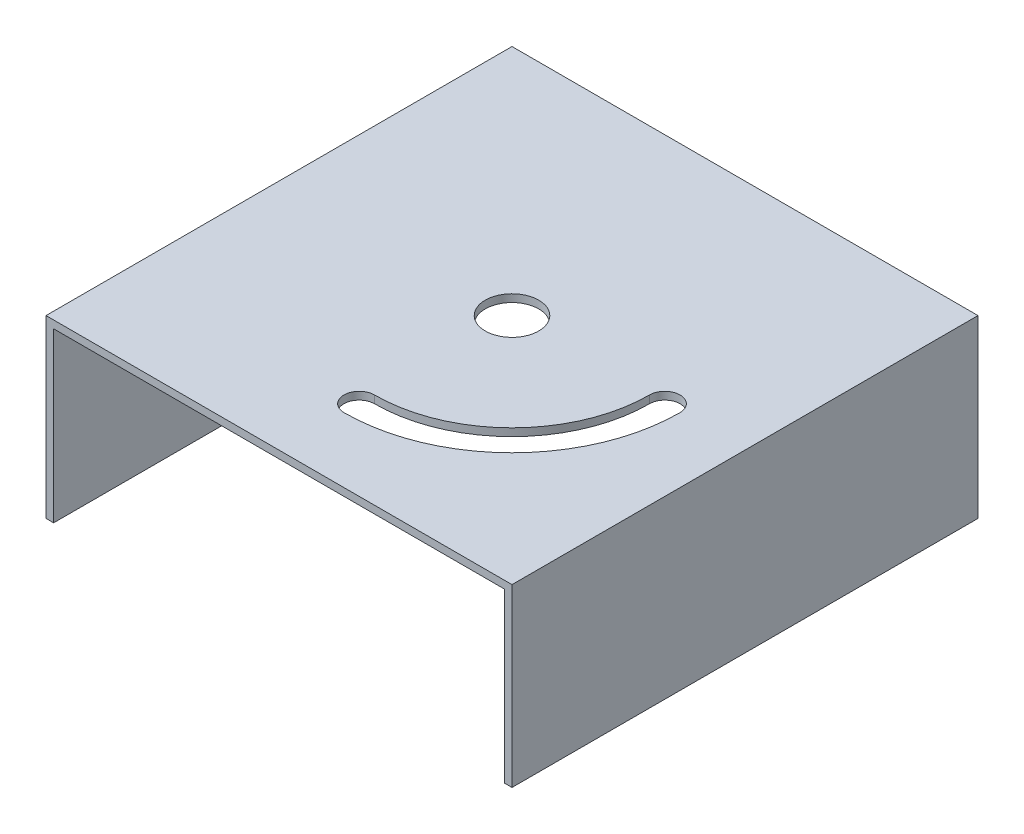
ISO-10303-21;
HEADER;
FILE_DESCRIPTION(('STEP AP214'),'2;1');
FILE_NAME('part.step','',(''),(''),'','','');
FILE_SCHEMA(('AUTOMOTIVE_DESIGN { 1 0 10303 214 1 1 1 1 }'));
ENDSEC;
DATA;
#1=APPLICATION_CONTEXT('core data for automotive mechanical design processes');
#2=APPLICATION_PROTOCOL_DEFINITION('international standard','automotive_design',2000,#1);
#3=PRODUCT_CONTEXT('',#1,'mechanical');
#4=PRODUCT('Part','Part','',(#3));
#5=PRODUCT_RELATED_PRODUCT_CATEGORY('part','',(#4));
#6=PRODUCT_DEFINITION_FORMATION('','',#4);
#7=PRODUCT_DEFINITION_CONTEXT('part definition',#1,'design');
#8=PRODUCT_DEFINITION('design','',#6,#7);
#9=PRODUCT_DEFINITION_SHAPE('','',#8);
#10=(LENGTH_UNIT() NAMED_UNIT(*) SI_UNIT(.MILLI.,.METRE.));
#11=(NAMED_UNIT(*) PLANE_ANGLE_UNIT() SI_UNIT($,.RADIAN.));
#12=(NAMED_UNIT(*) SI_UNIT($,.STERADIAN.) SOLID_ANGLE_UNIT());
#13=UNCERTAINTY_MEASURE_WITH_UNIT(LENGTH_MEASURE(1.E-05),#10,'distance_accuracy_value','');
#14=(GEOMETRIC_REPRESENTATION_CONTEXT(3) GLOBAL_UNCERTAINTY_ASSIGNED_CONTEXT((#13)) GLOBAL_UNIT_ASSIGNED_CONTEXT((#10,
#11,#12)) REPRESENTATION_CONTEXT('',''));
#15=CARTESIAN_POINT('',(0.,0.,0.));
#16=DIRECTION('',(0.,0.,1.));
#17=DIRECTION('',(1.,0.,0.));
#18=AXIS2_PLACEMENT_3D('',#15,#16,#17);
#19=CARTESIAN_POINT('',(10.,0.,610.));
#20=DIRECTION('',(-1.,0.,0.));
#21=DIRECTION('',(0.,0.,1.));
#22=AXIS2_PLACEMENT_3D('',#19,#20,#21);
#23=PLANE('',#22);
#24=DIRECTION('',(0.,1.,0.));
#25=VECTOR('',#24,1.);
#26=CARTESIAN_POINT('',(10.,0.,0.));
#27=LINE('',#26,#25);
#28=CARTESIAN_POINT('',(10.,-30.,0.));
#29=VERTEX_POINT('',#28);
#30=CARTESIAN_POINT('',(10.,190.,0.));
#31=VERTEX_POINT('',#30);
#32=EDGE_CURVE('E198',#29,#31,#27,.T.);
#33=ORIENTED_EDGE('',*,*,#32,.T.);
#34=DIRECTION('',(0.,0.,-1.));
#35=VECTOR('',#34,1.);
#36=CARTESIAN_POINT('',(10.,190.,610.));
#37=LINE('',#36,#35);
#38=CARTESIAN_POINT('',(10.,190.,610.));
#39=VERTEX_POINT('',#38);
#40=EDGE_CURVE('E12',#39,#31,#37,.T.);
#41=ORIENTED_EDGE('',*,*,#40,.F.);
#42=DIRECTION('',(0.,1.,0.));
#43=VECTOR('',#42,1.);
#44=CARTESIAN_POINT('',(10.,0.,610.));
#45=LINE('',#44,#43);
#46=CARTESIAN_POINT('',(10.,-30.,610.));
#47=VERTEX_POINT('',#46);
#48=EDGE_CURVE('E199',#47,#39,#45,.T.);
#49=ORIENTED_EDGE('',*,*,#48,.F.);
#50=DIRECTION('',(0.,0.,1.));
#51=VECTOR('',#50,1.);
#52=CARTESIAN_POINT('',(10.,-30.,0.));
#53=LINE('',#52,#51);
#54=EDGE_CURVE('E192',#29,#47,#53,.T.);
#55=ORIENTED_EDGE('',*,*,#54,.F.);
#56=EDGE_LOOP('',(#33,#41,#49,#55));
#57=FACE_BOUND('',#56,.T.);
#58=ADVANCED_FACE('F47',(#57),#23,.F.);
#59=CARTESIAN_POINT('',(10.,190.,610.));
#60=DIRECTION('',(0.,1.,0.));
#61=DIRECTION('',(0.,0.,1.));
#62=AXIS2_PLACEMENT_3D('',#59,#60,#61);
#63=PLANE('',#62);
#64=CARTESIAN_POINT('',(305.,190.,305.));
#65=DIRECTION('',(0.,1.,0.));
#66=DIRECTION('',(0.,0.,1.));
#67=AXIS2_PLACEMENT_3D('',#64,#65,#66);
#68=CIRCLE('',#67,35.);
#69=CARTESIAN_POINT('',(305.,190.,340.));
#70=VERTEX_POINT('',#69);
#71=EDGE_CURVE('E165',#70,#70,#68,.T.);
#72=ORIENTED_EDGE('',*,*,#71,.T.);
#73=EDGE_LOOP('',(#72));
#74=FACE_BOUND('',#73,.T.);
#75=CARTESIAN_POINT('',(305.,190.,505.));
#76=DIRECTION('',(0.,1.,0.));
#77=DIRECTION('',(0.,0.,1.));
#78=AXIS2_PLACEMENT_3D('',#75,#76,#77);
#79=CIRCLE('',#78,20.);
#80=CARTESIAN_POINT('',(305.,190.,485.));
#81=VERTEX_POINT('',#80);
#82=CARTESIAN_POINT('',(305.,190.,525.));
#83=VERTEX_POINT('',#82);
#84=EDGE_CURVE('E140',#81,#83,#79,.T.);
#85=ORIENTED_EDGE('',*,*,#84,.T.);
#86=CARTESIAN_POINT('',(305.,190.,305.));
#87=DIRECTION('',(0.,1.,0.));
#88=DIRECTION('',(0.,0.,1.));
#89=AXIS2_PLACEMENT_3D('',#86,#87,#88);
#90=CIRCLE('',#89,220.);
#91=CARTESIAN_POINT('',(525.,190.,305.));
#92=VERTEX_POINT('',#91);
#93=EDGE_CURVE('E137',#83,#92,#90,.T.);
#94=ORIENTED_EDGE('',*,*,#93,.T.);
#95=CARTESIAN_POINT('',(505.,190.,305.));
#96=DIRECTION('',(0.,1.,0.));
#97=DIRECTION('',(0.,0.,1.));
#98=AXIS2_PLACEMENT_3D('',#95,#96,#97);
#99=CIRCLE('',#98,20.);
#100=CARTESIAN_POINT('',(485.,190.,305.));
#101=VERTEX_POINT('',#100);
#102=EDGE_CURVE('E143',#92,#101,#99,.T.);
#103=ORIENTED_EDGE('',*,*,#102,.T.);
#104=CARTESIAN_POINT('',(305.,190.,305.));
#105=DIRECTION('',(0.,1.,0.));
#106=DIRECTION('',(0.,0.,1.));
#107=AXIS2_PLACEMENT_3D('',#104,#105,#106);
#108=CIRCLE('',#107,180.);
#109=EDGE_CURVE('E147',#81,#101,#108,.T.);
#110=ORIENTED_EDGE('',*,*,#109,.F.);
#111=EDGE_LOOP('',(#85,#94,#103,#110));
#112=FACE_BOUND('',#111,.T.);
#113=DIRECTION('',(1.,0.,0.));
#114=VECTOR('',#113,1.);
#115=CARTESIAN_POINT('',(10.,190.,0.));
#116=LINE('',#115,#114);
#117=CARTESIAN_POINT('',(600.,190.,0.));
#118=VERTEX_POINT('',#117);
#119=EDGE_CURVE('E214',#31,#118,#116,.T.);
#120=ORIENTED_EDGE('',*,*,#119,.T.);
#121=DIRECTION('',(0.,0.,-1.));
#122=VECTOR('',#121,1.);
#123=CARTESIAN_POINT('',(600.,190.,610.));
#124=LINE('',#123,#122);
#125=CARTESIAN_POINT('',(600.,190.,610.));
#126=VERTEX_POINT('',#125);
#127=EDGE_CURVE('E54',#126,#118,#124,.T.);
#128=ORIENTED_EDGE('',*,*,#127,.F.);
#129=DIRECTION('',(1.,0.,0.));
#130=VECTOR('',#129,1.);
#131=CARTESIAN_POINT('',(10.,190.,610.));
#132=LINE('',#131,#130);
#133=EDGE_CURVE('E201',#39,#126,#132,.T.);
#134=ORIENTED_EDGE('',*,*,#133,.F.);
#135=ORIENTED_EDGE('',*,*,#40,.T.);
#136=EDGE_LOOP('',(#120,#128,#134,#135));
#137=FACE_BOUND('',#136,.T.);
#138=ADVANCED_FACE('F149',(#74,#112,#137),#63,.F.);
#139=CARTESIAN_POINT('',(600.,190.,610.));
#140=DIRECTION('',(1.,0.,0.));
#141=DIRECTION('',(0.,0.,-1.));
#142=AXIS2_PLACEMENT_3D('',#139,#140,#141);
#143=PLANE('',#142);
#144=DIRECTION('',(0.,-1.,0.));
#145=VECTOR('',#144,1.);
#146=CARTESIAN_POINT('',(600.,190.,0.));
#147=LINE('',#146,#145);
#148=CARTESIAN_POINT('',(600.,-30.,0.));
#149=VERTEX_POINT('',#148);
#150=EDGE_CURVE('E216',#118,#149,#147,.T.);
#151=ORIENTED_EDGE('',*,*,#150,.T.);
#152=DIRECTION('',(0.,0.,-1.));
#153=VECTOR('',#152,1.);
#154=CARTESIAN_POINT('',(600.,-30.,610.));
#155=LINE('',#154,#153);
#156=CARTESIAN_POINT('',(600.,-30.,610.));
#157=VERTEX_POINT('',#156);
#158=EDGE_CURVE('E171',#157,#149,#155,.T.);
#159=ORIENTED_EDGE('',*,*,#158,.F.);
#160=DIRECTION('',(0.,-1.,0.));
#161=VECTOR('',#160,1.);
#162=CARTESIAN_POINT('',(600.,190.,610.));
#163=LINE('',#162,#161);
#164=EDGE_CURVE('E204',#126,#157,#163,.T.);
#165=ORIENTED_EDGE('',*,*,#164,.F.);
#166=ORIENTED_EDGE('',*,*,#127,.T.);
#167=EDGE_LOOP('',(#151,#159,#165,#166));
#168=FACE_BOUND('',#167,.T.);
#169=ADVANCED_FACE('F232',(#168),#143,.F.);
#170=CARTESIAN_POINT('',(610.,200.,610.));
#171=DIRECTION('',(-1.,0.,0.));
#172=DIRECTION('',(0.,-1.,0.));
#173=AXIS2_PLACEMENT_3D('',#170,#171,#172);
#174=PLANE('',#173);
#175=DIRECTION('',(0.,1.,0.));
#176=VECTOR('',#175,1.);
#177=CARTESIAN_POINT('',(610.,200.,0.));
#178=LINE('',#177,#176);
#179=CARTESIAN_POINT('',(610.,-30.,0.));
#180=VERTEX_POINT('',#179);
#181=CARTESIAN_POINT('',(610.,200.,0.));
#182=VERTEX_POINT('',#181);
#183=EDGE_CURVE('E218',#180,#182,#178,.T.);
#184=ORIENTED_EDGE('',*,*,#183,.T.);
#185=DIRECTION('',(0.,0.,-1.));
#186=VECTOR('',#185,1.);
#187=CARTESIAN_POINT('',(610.,200.,610.));
#188=LINE('',#187,#186);
#189=CARTESIAN_POINT('',(610.,200.,610.));
#190=VERTEX_POINT('',#189);
#191=EDGE_CURVE('E225',#190,#182,#188,.T.);
#192=ORIENTED_EDGE('',*,*,#191,.F.);
#193=DIRECTION('',(0.,1.,0.));
#194=VECTOR('',#193,1.);
#195=CARTESIAN_POINT('',(610.,200.,610.));
#196=LINE('',#195,#194);
#197=CARTESIAN_POINT('',(610.,-30.,610.));
#198=VERTEX_POINT('',#197);
#199=EDGE_CURVE('E206',#198,#190,#196,.T.);
#200=ORIENTED_EDGE('',*,*,#199,.F.);
#201=DIRECTION('',(0.,0.,1.));
#202=VECTOR('',#201,1.);
#203=CARTESIAN_POINT('',(610.,-30.,0.));
#204=LINE('',#203,#202);
#205=EDGE_CURVE('E180',#180,#198,#204,.T.);
#206=ORIENTED_EDGE('',*,*,#205,.F.);
#207=EDGE_LOOP('',(#184,#192,#200,#206));
#208=FACE_BOUND('',#207,.T.);
#209=ADVANCED_FACE('F264',(#208),#174,.F.);
#210=CARTESIAN_POINT('',(0.,200.,610.));
#211=DIRECTION('',(0.,-1.,0.));
#212=DIRECTION('',(0.,0.,-1.));
#213=AXIS2_PLACEMENT_3D('',#210,#211,#212);
#214=PLANE('',#213);
#215=CARTESIAN_POINT('',(305.,200.,305.));
#216=DIRECTION('',(0.,1.,0.));
#217=DIRECTION('',(0.,0.,1.));
#218=AXIS2_PLACEMENT_3D('',#215,#216,#217);
#219=CIRCLE('',#218,35.);
#220=CARTESIAN_POINT('',(305.,200.,340.));
#221=VERTEX_POINT('',#220);
#222=EDGE_CURVE('E158',#221,#221,#219,.T.);
#223=ORIENTED_EDGE('',*,*,#222,.F.);
#224=EDGE_LOOP('',(#223));
#225=FACE_BOUND('',#224,.T.);
#226=CARTESIAN_POINT('',(505.,200.,305.));
#227=DIRECTION('',(0.,1.,0.));
#228=DIRECTION('',(0.,0.,1.));
#229=AXIS2_PLACEMENT_3D('',#226,#227,#228);
#230=CIRCLE('',#229,20.);
#231=CARTESIAN_POINT('',(525.,200.,305.));
#232=VERTEX_POINT('',#231);
#233=CARTESIAN_POINT('',(485.,200.,305.));
#234=VERTEX_POINT('',#233);
#235=EDGE_CURVE('E164',#232,#234,#230,.T.);
#236=ORIENTED_EDGE('',*,*,#235,.F.);
#237=CARTESIAN_POINT('',(305.,200.,305.));
#238=DIRECTION('',(0.,1.,0.));
#239=DIRECTION('',(0.,0.,1.));
#240=AXIS2_PLACEMENT_3D('',#237,#238,#239);
#241=CIRCLE('',#240,220.);
#242=CARTESIAN_POINT('',(305.,200.,525.));
#243=VERTEX_POINT('',#242);
#244=EDGE_CURVE('E69',#243,#232,#241,.T.);
#245=ORIENTED_EDGE('',*,*,#244,.F.);
#246=CARTESIAN_POINT('',(305.,200.,505.));
#247=DIRECTION('',(0.,1.,0.));
#248=DIRECTION('',(0.,0.,1.));
#249=AXIS2_PLACEMENT_3D('',#246,#247,#248);
#250=CIRCLE('',#249,20.);
#251=CARTESIAN_POINT('',(305.,200.,485.));
#252=VERTEX_POINT('',#251);
#253=EDGE_CURVE('E152',#252,#243,#250,.T.);
#254=ORIENTED_EDGE('',*,*,#253,.F.);
#255=CARTESIAN_POINT('',(305.,200.,305.));
#256=DIRECTION('',(0.,1.,0.));
#257=DIRECTION('',(0.,0.,1.));
#258=AXIS2_PLACEMENT_3D('',#255,#256,#257);
#259=CIRCLE('',#258,180.);
#260=EDGE_CURVE('E155',#252,#234,#259,.T.);
#261=ORIENTED_EDGE('',*,*,#260,.T.);
#262=EDGE_LOOP('',(#236,#245,#254,#261));
#263=FACE_BOUND('',#262,.T.);
#264=DIRECTION('',(-1.,0.,0.));
#265=VECTOR('',#264,1.);
#266=CARTESIAN_POINT('',(0.,200.,0.));
#267=LINE('',#266,#265);
#268=CARTESIAN_POINT('',(0.,200.,0.));
#269=VERTEX_POINT('',#268);
#270=EDGE_CURVE('E220',#182,#269,#267,.T.);
#271=ORIENTED_EDGE('',*,*,#270,.T.);
#272=DIRECTION('',(0.,0.,-1.));
#273=VECTOR('',#272,1.);
#274=CARTESIAN_POINT('',(0.,200.,610.));
#275=LINE('',#274,#273);
#276=CARTESIAN_POINT('',(0.,200.,610.));
#277=VERTEX_POINT('',#276);
#278=EDGE_CURVE('E212',#277,#269,#275,.T.);
#279=ORIENTED_EDGE('',*,*,#278,.F.);
#280=DIRECTION('',(-1.,0.,0.));
#281=VECTOR('',#280,1.);
#282=CARTESIAN_POINT('',(0.,200.,610.));
#283=LINE('',#282,#281);
#284=EDGE_CURVE('E208',#190,#277,#283,.T.);
#285=ORIENTED_EDGE('',*,*,#284,.F.);
#286=ORIENTED_EDGE('',*,*,#191,.T.);
#287=EDGE_LOOP('',(#271,#279,#285,#286));
#288=FACE_BOUND('',#287,.T.);
#289=ADVANCED_FACE('F261',(#225,#263,#288),#214,.F.);
#290=CARTESIAN_POINT('',(0.,0.,610.));
#291=DIRECTION('',(1.,0.,0.));
#292=DIRECTION('',(0.,0.,-1.));
#293=AXIS2_PLACEMENT_3D('',#290,#291,#292);
#294=PLANE('',#293);
#295=DIRECTION('',(0.,-1.,0.));
#296=VECTOR('',#295,1.);
#297=CARTESIAN_POINT('',(0.,0.,0.));
#298=LINE('',#297,#296);
#299=CARTESIAN_POINT('',(0.,-30.,0.));
#300=VERTEX_POINT('',#299);
#301=EDGE_CURVE('E202',#269,#300,#298,.T.);
#302=ORIENTED_EDGE('',*,*,#301,.T.);
#303=DIRECTION('',(0.,0.,-1.));
#304=VECTOR('',#303,1.);
#305=CARTESIAN_POINT('',(0.,-30.,610.));
#306=LINE('',#305,#304);
#307=CARTESIAN_POINT('',(0.,-30.,610.));
#308=VERTEX_POINT('',#307);
#309=EDGE_CURVE('E186',#308,#300,#306,.T.);
#310=ORIENTED_EDGE('',*,*,#309,.F.);
#311=DIRECTION('',(0.,-1.,0.));
#312=VECTOR('',#311,1.);
#313=CARTESIAN_POINT('',(0.,0.,610.));
#314=LINE('',#313,#312);
#315=EDGE_CURVE('E210',#277,#308,#314,.T.);
#316=ORIENTED_EDGE('',*,*,#315,.F.);
#317=ORIENTED_EDGE('',*,*,#278,.T.);
#318=EDGE_LOOP('',(#302,#310,#316,#317));
#319=FACE_BOUND('',#318,.T.);
#320=ADVANCED_FACE('F258',(#319),#294,.F.);
#321=CARTESIAN_POINT('',(0.,0.,610.));
#322=DIRECTION('',(0.,0.,1.));
#323=DIRECTION('',(1.,0.,0.));
#324=AXIS2_PLACEMENT_3D('',#321,#322,#323);
#325=PLANE('',#324);
#326=ORIENTED_EDGE('',*,*,#315,.T.);
#327=DIRECTION('',(-1.,0.,0.));
#328=VECTOR('',#327,1.);
#329=CARTESIAN_POINT('',(10.,-30.,610.));
#330=LINE('',#329,#328);
#331=EDGE_CURVE('E195',#47,#308,#330,.T.);
#332=ORIENTED_EDGE('',*,*,#331,.F.);
#333=ORIENTED_EDGE('',*,*,#48,.T.);
#334=ORIENTED_EDGE('',*,*,#133,.T.);
#335=ORIENTED_EDGE('',*,*,#164,.T.);
#336=DIRECTION('',(-1.,0.,0.));
#337=VECTOR('',#336,1.);
#338=CARTESIAN_POINT('',(610.,-30.,610.));
#339=LINE('',#338,#337);
#340=EDGE_CURVE('E183',#198,#157,#339,.T.);
#341=ORIENTED_EDGE('',*,*,#340,.F.);
#342=ORIENTED_EDGE('',*,*,#199,.T.);
#343=ORIENTED_EDGE('',*,*,#284,.T.);
#344=EDGE_LOOP('',(#326,#332,#333,#334,#335,#341,#342,#343));
#345=FACE_BOUND('',#344,.T.);
#346=ADVANCED_FACE('F245',(#345),#325,.T.);
#347=CARTESIAN_POINT('',(0.,0.,0.));
#348=DIRECTION('',(0.,0.,1.));
#349=DIRECTION('',(1.,0.,0.));
#350=AXIS2_PLACEMENT_3D('',#347,#348,#349);
#351=PLANE('',#350);
#352=ORIENTED_EDGE('',*,*,#32,.F.);
#353=DIRECTION('',(1.,0.,0.));
#354=VECTOR('',#353,1.);
#355=CARTESIAN_POINT('',(0.,-30.,0.));
#356=LINE('',#355,#354);
#357=EDGE_CURVE('E189',#300,#29,#356,.T.);
#358=ORIENTED_EDGE('',*,*,#357,.F.);
#359=ORIENTED_EDGE('',*,*,#301,.F.);
#360=ORIENTED_EDGE('',*,*,#270,.F.);
#361=ORIENTED_EDGE('',*,*,#183,.F.);
#362=DIRECTION('',(1.,0.,0.));
#363=VECTOR('',#362,1.);
#364=CARTESIAN_POINT('',(600.,-30.,0.));
#365=LINE('',#364,#363);
#366=EDGE_CURVE('E177',#149,#180,#365,.T.);
#367=ORIENTED_EDGE('',*,*,#366,.F.);
#368=ORIENTED_EDGE('',*,*,#150,.F.);
#369=ORIENTED_EDGE('',*,*,#119,.F.);
#370=EDGE_LOOP('',(#352,#358,#359,#360,#361,#367,#368,#369));
#371=FACE_BOUND('',#370,.T.);
#372=ADVANCED_FACE('F238',(#371),#351,.F.);
#373=CARTESIAN_POINT('',(0.,-30.,0.));
#374=DIRECTION('',(0.,-1.,0.));
#375=DIRECTION('',(0.,0.,-1.));
#376=AXIS2_PLACEMENT_3D('',#373,#374,#375);
#377=PLANE('',#376);
#378=ORIENTED_EDGE('',*,*,#309,.T.);
#379=ORIENTED_EDGE('',*,*,#357,.T.);
#380=ORIENTED_EDGE('',*,*,#54,.T.);
#381=ORIENTED_EDGE('',*,*,#331,.T.);
#382=EDGE_LOOP('',(#378,#379,#380,#381));
#383=FACE_BOUND('',#382,.T.);
#384=ADVANCED_FACE('F254',(#383),#377,.T.);
#385=CARTESIAN_POINT('',(0.,-30.,0.));
#386=DIRECTION('',(0.,-1.,0.));
#387=DIRECTION('',(0.,0.,-1.));
#388=AXIS2_PLACEMENT_3D('',#385,#386,#387);
#389=PLANE('',#388);
#390=ORIENTED_EDGE('',*,*,#158,.T.);
#391=ORIENTED_EDGE('',*,*,#366,.T.);
#392=ORIENTED_EDGE('',*,*,#205,.T.);
#393=ORIENTED_EDGE('',*,*,#340,.T.);
#394=EDGE_LOOP('',(#390,#391,#392,#393));
#395=FACE_BOUND('',#394,.T.);
#396=ADVANCED_FACE('F242',(#395),#389,.T.);
#397=CARTESIAN_POINT('',(305.,190.,305.));
#398=DIRECTION('',(0.,1.,0.));
#399=DIRECTION('',(0.,0.,1.));
#400=AXIS2_PLACEMENT_3D('',#397,#398,#399);
#401=CYLINDRICAL_SURFACE('',#400,220.);
#402=ORIENTED_EDGE('',*,*,#244,.T.);
#403=DIRECTION('',(0.,1.,0.));
#404=VECTOR('',#403,1.);
#405=CARTESIAN_POINT('',(525.,190.,305.));
#406=LINE('',#405,#404);
#407=EDGE_CURVE('E134',#92,#232,#406,.T.);
#408=ORIENTED_EDGE('',*,*,#407,.F.);
#409=ORIENTED_EDGE('',*,*,#93,.F.);
#410=DIRECTION('',(0.,1.,0.));
#411=VECTOR('',#410,1.);
#412=CARTESIAN_POINT('',(305.,190.,525.));
#413=LINE('',#412,#411);
#414=EDGE_CURVE('E169',#83,#243,#413,.T.);
#415=ORIENTED_EDGE('',*,*,#414,.T.);
#416=EDGE_LOOP('',(#402,#408,#409,#415));
#417=FACE_BOUND('',#416,.T.);
#418=ADVANCED_FACE('F135',(#417),#401,.F.);
#419=CARTESIAN_POINT('',(305.,190.,505.));
#420=DIRECTION('',(0.,1.,0.));
#421=DIRECTION('',(0.,0.,1.));
#422=AXIS2_PLACEMENT_3D('',#419,#420,#421);
#423=CYLINDRICAL_SURFACE('',#422,20.);
#424=ORIENTED_EDGE('',*,*,#253,.T.);
#425=ORIENTED_EDGE('',*,*,#414,.F.);
#426=ORIENTED_EDGE('',*,*,#84,.F.);
#427=DIRECTION('',(0.,1.,0.));
#428=VECTOR('',#427,1.);
#429=CARTESIAN_POINT('',(305.,190.,485.));
#430=LINE('',#429,#428);
#431=EDGE_CURVE('E172',#81,#252,#430,.T.);
#432=ORIENTED_EDGE('',*,*,#431,.T.);
#433=EDGE_LOOP('',(#424,#425,#426,#432));
#434=FACE_BOUND('',#433,.T.);
#435=ADVANCED_FACE('F294',(#434),#423,.F.);
#436=CARTESIAN_POINT('',(305.,190.,305.));
#437=DIRECTION('',(0.,1.,0.));
#438=DIRECTION('',(0.,0.,1.));
#439=AXIS2_PLACEMENT_3D('',#436,#437,#438);
#440=CYLINDRICAL_SURFACE('',#439,180.);
#441=ORIENTED_EDGE('',*,*,#260,.F.);
#442=ORIENTED_EDGE('',*,*,#431,.F.);
#443=ORIENTED_EDGE('',*,*,#109,.T.);
#444=DIRECTION('',(0.,1.,0.));
#445=VECTOR('',#444,1.);
#446=CARTESIAN_POINT('',(485.,190.,305.));
#447=LINE('',#446,#445);
#448=EDGE_CURVE('E61',#101,#234,#447,.T.);
#449=ORIENTED_EDGE('',*,*,#448,.T.);
#450=EDGE_LOOP('',(#441,#442,#443,#449));
#451=FACE_BOUND('',#450,.T.);
#452=ADVANCED_FACE('F292',(#451),#440,.T.);
#453=CARTESIAN_POINT('',(505.,190.,305.));
#454=DIRECTION('',(0.,1.,0.));
#455=DIRECTION('',(0.,0.,1.));
#456=AXIS2_PLACEMENT_3D('',#453,#454,#455);
#457=CYLINDRICAL_SURFACE('',#456,20.);
#458=ORIENTED_EDGE('',*,*,#235,.T.);
#459=ORIENTED_EDGE('',*,*,#448,.F.);
#460=ORIENTED_EDGE('',*,*,#102,.F.);
#461=ORIENTED_EDGE('',*,*,#407,.T.);
#462=EDGE_LOOP('',(#458,#459,#460,#461));
#463=FACE_BOUND('',#462,.T.);
#464=ADVANCED_FACE('F144',(#463),#457,.F.);
#465=CARTESIAN_POINT('',(305.,190.,305.));
#466=DIRECTION('',(0.,1.,0.));
#467=DIRECTION('',(0.,0.,1.));
#468=AXIS2_PLACEMENT_3D('',#465,#466,#467);
#469=CYLINDRICAL_SURFACE('',#468,35.);
#470=ORIENTED_EDGE('',*,*,#71,.F.);
#471=EDGE_LOOP('',(#470));
#472=FACE_BOUND('',#471,.T.);
#473=ORIENTED_EDGE('',*,*,#222,.T.);
#474=EDGE_LOOP('',(#473));
#475=FACE_BOUND('',#474,.T.);
#476=ADVANCED_FACE('F287',(#472,#475),#469,.F.);
#477=CLOSED_SHELL('',(#58,#138,#169,#209,#289,#320,#346,#372,#384,#396,#418,#435,#452,#464,#476));
#478=MANIFOLD_SOLID_BREP('B2',#477);
#479=ADVANCED_BREP_SHAPE_REPRESENTATION('',(#18,#478),#14);
#480=SHAPE_DEFINITION_REPRESENTATION(#9,#479);
ENDSEC;
END-ISO-10303-21;
